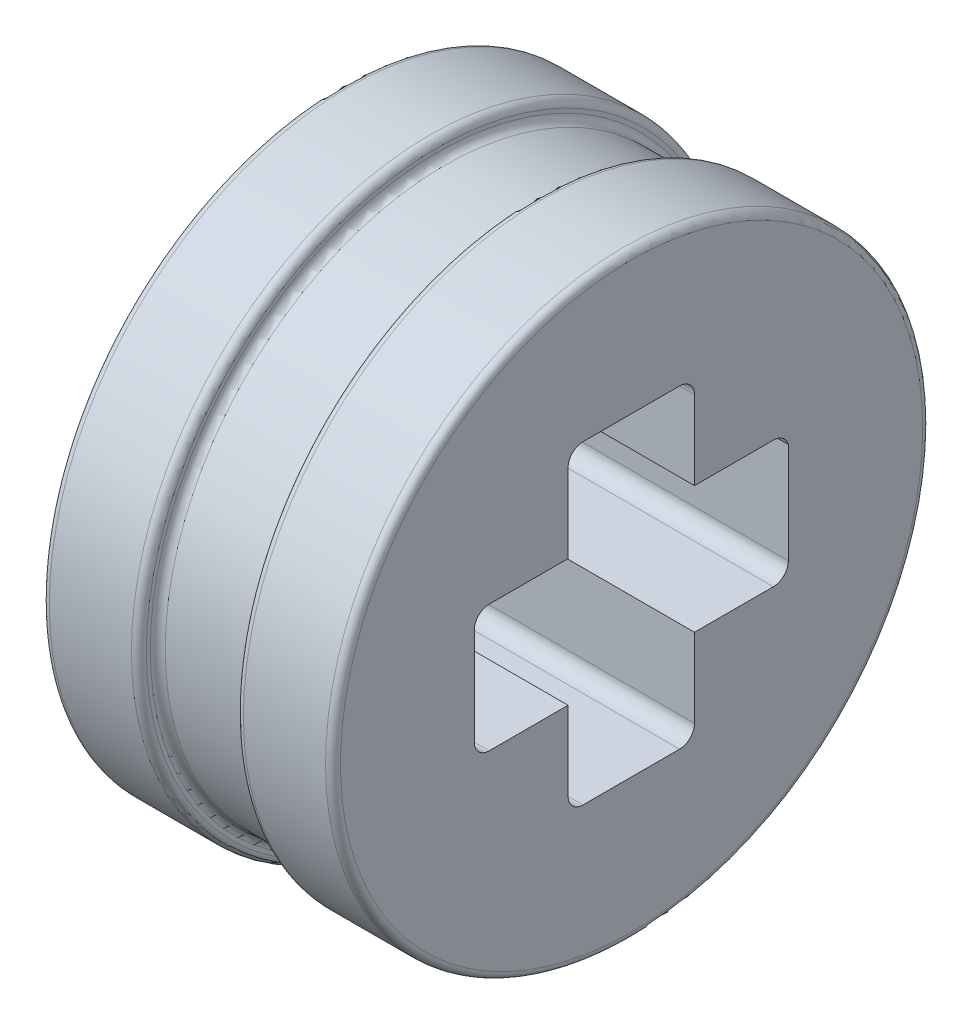
ISO-10303-21;
HEADER;
FILE_DESCRIPTION(('STEP AP214'),'2;1');
FILE_NAME('part.step','',(''),(''),'','','');
FILE_SCHEMA(('AUTOMOTIVE_DESIGN { 1 0 10303 214 1 1 1 1 }'));
ENDSEC;
DATA;
#1=APPLICATION_CONTEXT('core data for automotive mechanical design processes');
#2=APPLICATION_PROTOCOL_DEFINITION('international standard','automotive_design',2000,#1);
#3=PRODUCT_CONTEXT('',#1,'mechanical');
#4=PRODUCT('Part','Part','',(#3));
#5=PRODUCT_RELATED_PRODUCT_CATEGORY('part','',(#4));
#6=PRODUCT_DEFINITION_FORMATION('','',#4);
#7=PRODUCT_DEFINITION_CONTEXT('part definition',#1,'design');
#8=PRODUCT_DEFINITION('design','',#6,#7);
#9=PRODUCT_DEFINITION_SHAPE('','',#8);
#10=(LENGTH_UNIT() NAMED_UNIT(*) SI_UNIT(.MILLI.,.METRE.));
#11=(NAMED_UNIT(*) PLANE_ANGLE_UNIT() SI_UNIT($,.RADIAN.));
#12=(NAMED_UNIT(*) SI_UNIT($,.STERADIAN.) SOLID_ANGLE_UNIT());
#13=UNCERTAINTY_MEASURE_WITH_UNIT(LENGTH_MEASURE(1.E-05),#10,'distance_accuracy_value','');
#14=(GEOMETRIC_REPRESENTATION_CONTEXT(3) GLOBAL_UNCERTAINTY_ASSIGNED_CONTEXT((#13)) GLOBAL_UNIT_ASSIGNED_CONTEXT((#10,
#11,#12)) REPRESENTATION_CONTEXT('',''));
#15=CARTESIAN_POINT('',(0.,0.,0.));
#16=DIRECTION('',(0.,0.,1.));
#17=DIRECTION('',(1.,0.,0.));
#18=AXIS2_PLACEMENT_3D('',#15,#16,#17);
#19=CARTESIAN_POINT('',(6.45048689938073,0.,-4.));
#20=DIRECTION('',(-1.,0.,0.));
#21=DIRECTION('',(0.,0.,1.));
#22=AXIS2_PLACEMENT_3D('',#19,#20,#21);
#23=PLANE('',#22);
#24=CARTESIAN_POINT('',(6.45048689938073,0.,0.));
#25=DIRECTION('',(-1.,0.,0.));
#26=DIRECTION('',(0.,0.,1.));
#27=AXIS2_PLACEMENT_3D('',#24,#25,#26);
#28=CIRCLE('',#27,3.84702465337202);
#29=CARTESIAN_POINT('',(6.45048689938073,0.,3.84702465337202));
#30=VERTEX_POINT('',#29);
#31=EDGE_CURVE('E406',#30,#30,#28,.T.);
#32=ORIENTED_EDGE('',*,*,#31,.T.);
#33=EDGE_LOOP('',(#32));
#34=FACE_BOUND('',#33,.T.);
#35=CARTESIAN_POINT('',(6.45048689938073,0.,0.));
#36=DIRECTION('',(-1.,0.,0.));
#37=DIRECTION('',(0.,0.,1.));
#38=AXIS2_PLACEMENT_3D('',#35,#36,#37);
#39=CIRCLE('',#38,3.9);
#40=CARTESIAN_POINT('',(6.45048689938073,0.,3.9));
#41=VERTEX_POINT('',#40);
#42=EDGE_CURVE('E400',#41,#41,#39,.F.);
#43=ORIENTED_EDGE('',*,*,#42,.T.);
#44=EDGE_LOOP('',(#43));
#45=FACE_BOUND('',#44,.T.);
#46=ADVANCED_FACE('F45',(#34,#45),#23,.F.);
#47=CARTESIAN_POINT('',(7.75048689938073,0.,0.));
#48=DIRECTION('',(-1.,0.,0.));
#49=DIRECTION('',(0.,0.,1.));
#50=AXIS2_PLACEMENT_3D('',#47,#48,#49);
#51=CYLINDRICAL_SURFACE('',#50,4.);
#52=CARTESIAN_POINT('',(6.35048689938073,0.,0.));
#53=DIRECTION('',(-1.,0.,0.));
#54=DIRECTION('',(0.,0.,1.));
#55=AXIS2_PLACEMENT_3D('',#52,#53,#54);
#56=CIRCLE('',#55,4.);
#57=CARTESIAN_POINT('',(6.35048689938073,0.,4.));
#58=VERTEX_POINT('',#57);
#59=EDGE_CURVE('E397',#58,#58,#56,.T.);
#60=ORIENTED_EDGE('',*,*,#59,.T.);
#61=EDGE_LOOP('',(#60));
#62=FACE_BOUND('',#61,.T.);
#63=CARTESIAN_POINT('',(5.25,0.,0.));
#64=DIRECTION('',(1.,0.,0.));
#65=DIRECTION('',(0.,0.,-1.));
#66=AXIS2_PLACEMENT_3D('',#63,#64,#65);
#67=CIRCLE('',#66,4.);
#68=CARTESIAN_POINT('',(5.25,0.,-4.));
#69=VERTEX_POINT('',#68);
#70=EDGE_CURVE('E394',#69,#69,#67,.T.);
#71=ORIENTED_EDGE('',*,*,#70,.T.);
#72=EDGE_LOOP('',(#71));
#73=FACE_BOUND('',#72,.T.);
#74=ADVANCED_FACE('F425',(#62,#73),#51,.T.);
#75=CARTESIAN_POINT('',(7.75048689938073,0.,0.));
#76=DIRECTION('',(-1.,0.,0.));
#77=DIRECTION('',(0.,0.,1.));
#78=AXIS2_PLACEMENT_3D('',#75,#76,#77);
#79=CYLINDRICAL_SURFACE('',#78,3.74702465337202);
#80=CARTESIAN_POINT('',(6.55048689938073,0.,0.));
#81=DIRECTION('',(-1.,0.,0.));
#82=DIRECTION('',(0.,0.,1.));
#83=AXIS2_PLACEMENT_3D('',#80,#81,#82);
#84=CIRCLE('',#83,3.74702465337202);
#85=CARTESIAN_POINT('',(6.55048689938073,0.,3.74702465337202));
#86=VERTEX_POINT('',#85);
#87=EDGE_CURVE('E53',#86,#86,#84,.F.);
#88=ORIENTED_EDGE('',*,*,#87,.T.);
#89=EDGE_LOOP('',(#88));
#90=FACE_BOUND('',#89,.T.);
#91=CARTESIAN_POINT('',(7.65048689938073,0.,0.));
#92=DIRECTION('',(1.,0.,0.));
#93=DIRECTION('',(0.,0.,-1.));
#94=AXIS2_PLACEMENT_3D('',#91,#92,#93);
#95=CIRCLE('',#94,3.74702465337202);
#96=CARTESIAN_POINT('',(7.65048689938073,0.,-3.74702465337202));
#97=VERTEX_POINT('',#96);
#98=EDGE_CURVE('E409',#97,#97,#95,.F.);
#99=ORIENTED_EDGE('',*,*,#98,.T.);
#100=EDGE_LOOP('',(#99));
#101=FACE_BOUND('',#100,.T.);
#102=ADVANCED_FACE('F414',(#90,#101),#79,.T.);
#103=CARTESIAN_POINT('',(5.15,1.5,0.));
#104=DIRECTION('',(1.,0.,0.));
#105=DIRECTION('',(0.,0.,-1.));
#106=AXIS2_PLACEMENT_3D('',#103,#104,#105);
#107=PLANE('',#106);
#108=CARTESIAN_POINT('',(5.15,0.,0.));
#109=DIRECTION('',(1.,0.,0.));
#110=DIRECTION('',(0.,0.,-1.));
#111=AXIS2_PLACEMENT_3D('',#108,#109,#110);
#112=CIRCLE('',#111,3.9);
#113=CARTESIAN_POINT('',(5.15,0.,-3.9));
#114=VERTEX_POINT('',#113);
#115=EDGE_CURVE('E403',#114,#114,#112,.F.);
#116=ORIENTED_EDGE('',*,*,#115,.T.);
#117=EDGE_LOOP('',(#116));
#118=FACE_BOUND('',#117,.T.);
#119=DIRECTION('',(0.,-1.,0.));
#120=VECTOR('',#119,1.);
#121=CARTESIAN_POINT('',(5.15,0.858390623597305,-0.842935904204174));
#122=LINE('',#121,#120);
#123=CARTESIAN_POINT('',(5.15,1.91490213240289,-0.842935904204174));
#124=VERTEX_POINT('',#123);
#125=CARTESIAN_POINT('',(5.15,0.858390623597305,-0.842935904204174));
#126=VERTEX_POINT('',#125);
#127=EDGE_CURVE('E453',#124,#126,#122,.T.);
#128=ORIENTED_EDGE('',*,*,#127,.F.);
#129=CARTESIAN_POINT('',(5.15,1.91490213240289,-0.642935904204174));
#130=DIRECTION('',(-1.,0.,0.));
#131=DIRECTION('',(0.,0.,-1.));
#132=AXIS2_PLACEMENT_3D('',#129,#130,#131);
#133=CIRCLE('',#132,0.2);
#134=CARTESIAN_POINT('',(5.15,2.11490213240289,-0.642935904204174));
#135=VERTEX_POINT('',#134);
#136=EDGE_CURVE('E69',#135,#124,#133,.T.);
#137=ORIENTED_EDGE('',*,*,#136,.F.);
#138=DIRECTION('',(0.,0.,-1.));
#139=VECTOR('',#138,1.);
#140=CARTESIAN_POINT('',(5.15,2.11490213240289,-0.642935904204174));
#141=LINE('',#140,#139);
#142=CARTESIAN_POINT('',(5.15,2.11490213240289,0.650582266441982));
#143=VERTEX_POINT('',#142);
#144=EDGE_CURVE('E508',#143,#135,#141,.T.);
#145=ORIENTED_EDGE('',*,*,#144,.F.);
#146=CARTESIAN_POINT('',(5.15,1.91490213240289,0.650582266441982));
#147=DIRECTION('',(-1.,0.,0.));
#148=DIRECTION('',(0.,0.,1.));
#149=AXIS2_PLACEMENT_3D('',#146,#147,#148);
#150=CIRCLE('',#149,0.2);
#151=CARTESIAN_POINT('',(5.15,1.91490213240289,0.850582266441982));
#152=VERTEX_POINT('',#151);
#153=EDGE_CURVE('E505',#152,#143,#150,.T.);
#154=ORIENTED_EDGE('',*,*,#153,.F.);
#155=DIRECTION('',(0.,1.,0.));
#156=VECTOR('',#155,1.);
#157=CARTESIAN_POINT('',(5.15,1.91490213240289,0.850582266441982));
#158=LINE('',#157,#156);
#159=CARTESIAN_POINT('',(5.15,0.858390623597306,0.850582266441982));
#160=VERTEX_POINT('',#159);
#161=EDGE_CURVE('E503',#160,#152,#158,.T.);
#162=ORIENTED_EDGE('',*,*,#161,.F.);
#163=DIRECTION('',(0.,0.,-1.));
#164=VECTOR('',#163,1.);
#165=CARTESIAN_POINT('',(5.15,0.858390623597306,0.850582266441982));
#166=LINE('',#165,#164);
#167=CARTESIAN_POINT('',(5.15,0.858390623597306,1.90709377524756));
#168=VERTEX_POINT('',#167);
#169=EDGE_CURVE('E199',#168,#160,#166,.T.);
#170=ORIENTED_EDGE('',*,*,#169,.F.);
#171=CARTESIAN_POINT('',(5.15,0.658390623597305,1.90709377524756));
#172=DIRECTION('',(-1.,0.,0.));
#173=DIRECTION('',(0.,0.,-1.));
#174=AXIS2_PLACEMENT_3D('',#171,#172,#173);
#175=CIRCLE('',#174,0.2);
#176=CARTESIAN_POINT('',(5.15,0.658390623597305,2.10709377524756));
#177=VERTEX_POINT('',#176);
#178=EDGE_CURVE('E499',#177,#168,#175,.T.);
#179=ORIENTED_EDGE('',*,*,#178,.F.);
#180=DIRECTION('',(0.,1.,0.));
#181=VECTOR('',#180,1.);
#182=CARTESIAN_POINT('',(5.15,-0.642651568059718,2.10709377524756));
#183=LINE('',#182,#181);
#184=CARTESIAN_POINT('',(5.15,-0.642651568059718,2.10709377524756));
#185=VERTEX_POINT('',#184);
#186=EDGE_CURVE('E496',#185,#177,#183,.T.);
#187=ORIENTED_EDGE('',*,*,#186,.F.);
#188=CARTESIAN_POINT('',(5.15,-0.642651568059718,1.90709377524756));
#189=DIRECTION('',(-1.,0.,0.));
#190=DIRECTION('',(0.,0.,1.));
#191=AXIS2_PLACEMENT_3D('',#188,#189,#190);
#192=CIRCLE('',#191,0.200000000000001);
#193=CARTESIAN_POINT('',(5.15,-0.842651568059718,1.90709377524756));
#194=VERTEX_POINT('',#193);
#195=EDGE_CURVE('E493',#194,#185,#192,.T.);
#196=ORIENTED_EDGE('',*,*,#195,.F.);
#197=DIRECTION('',(0.,0.,1.));
#198=VECTOR('',#197,1.);
#199=CARTESIAN_POINT('',(5.15,-0.842651568059718,0.850582266441982));
#200=LINE('',#199,#198);
#201=CARTESIAN_POINT('',(5.15,-0.842651568059718,0.850582266441982));
#202=VERTEX_POINT('',#201);
#203=EDGE_CURVE('E490',#202,#194,#200,.T.);
#204=ORIENTED_EDGE('',*,*,#203,.F.);
#205=DIRECTION('',(0.,1.,0.));
#206=VECTOR('',#205,1.);
#207=CARTESIAN_POINT('',(5.15,-1.8991630768653,0.850582266441982));
#208=LINE('',#207,#206);
#209=CARTESIAN_POINT('',(5.15,-1.8991630768653,0.850582266441982));
#210=VERTEX_POINT('',#209);
#211=EDGE_CURVE('E487',#210,#202,#208,.T.);
#212=ORIENTED_EDGE('',*,*,#211,.F.);
#213=CARTESIAN_POINT('',(5.15,-1.8991630768653,0.650582266441982));
#214=DIRECTION('',(-1.,0.,0.));
#215=DIRECTION('',(0.,0.,-1.));
#216=AXIS2_PLACEMENT_3D('',#213,#214,#215);
#217=CIRCLE('',#216,0.2);
#218=CARTESIAN_POINT('',(5.15,-2.0991630768653,0.650582266441982));
#219=VERTEX_POINT('',#218);
#220=EDGE_CURVE('E484',#219,#210,#217,.T.);
#221=ORIENTED_EDGE('',*,*,#220,.F.);
#222=DIRECTION('',(0.,0.,1.));
#223=VECTOR('',#222,1.);
#224=CARTESIAN_POINT('',(5.15,-2.0991630768653,-0.642935904204174));
#225=LINE('',#224,#223);
#226=CARTESIAN_POINT('',(5.15,-2.0991630768653,-0.642935904204174));
#227=VERTEX_POINT('',#226);
#228=EDGE_CURVE('E481',#227,#219,#225,.T.);
#229=ORIENTED_EDGE('',*,*,#228,.F.);
#230=CARTESIAN_POINT('',(5.15,-1.8991630768653,-0.642935904204174));
#231=DIRECTION('',(-1.,0.,0.));
#232=DIRECTION('',(0.,0.,-1.));
#233=AXIS2_PLACEMENT_3D('',#230,#231,#232);
#234=CIRCLE('',#233,0.2);
#235=CARTESIAN_POINT('',(5.15,-1.8991630768653,-0.842935904204174));
#236=VERTEX_POINT('',#235);
#237=EDGE_CURVE('E478',#236,#227,#234,.T.);
#238=ORIENTED_EDGE('',*,*,#237,.F.);
#239=DIRECTION('',(0.,-1.,0.));
#240=VECTOR('',#239,1.);
#241=CARTESIAN_POINT('',(5.15,-0.842651568059718,-0.842935904204174));
#242=LINE('',#241,#240);
#243=CARTESIAN_POINT('',(5.15,-0.842651568059718,-0.842935904204174));
#244=VERTEX_POINT('',#243);
#245=EDGE_CURVE('E475',#244,#236,#242,.T.);
#246=ORIENTED_EDGE('',*,*,#245,.F.);
#247=DIRECTION('',(0.,0.,1.));
#248=VECTOR('',#247,1.);
#249=CARTESIAN_POINT('',(5.15,-0.842651568059718,-0.842935904204174));
#250=LINE('',#249,#248);
#251=CARTESIAN_POINT('',(5.15,-0.842651568059718,-1.89944741300976));
#252=VERTEX_POINT('',#251);
#253=EDGE_CURVE('E472',#252,#244,#250,.T.);
#254=ORIENTED_EDGE('',*,*,#253,.F.);
#255=CARTESIAN_POINT('',(5.15,-0.642651568059718,-1.89944741300976));
#256=DIRECTION('',(-1.,0.,0.));
#257=DIRECTION('',(0.,0.,-1.));
#258=AXIS2_PLACEMENT_3D('',#255,#256,#257);
#259=CIRCLE('',#258,0.2);
#260=CARTESIAN_POINT('',(5.15,-0.642651568059718,-2.09944741300976));
#261=VERTEX_POINT('',#260);
#262=EDGE_CURVE('E469',#261,#252,#259,.T.);
#263=ORIENTED_EDGE('',*,*,#262,.F.);
#264=DIRECTION('',(0.,-1.,0.));
#265=VECTOR('',#264,1.);
#266=CARTESIAN_POINT('',(5.15,-0.642651568059718,-2.09944741300976));
#267=LINE('',#266,#265);
#268=CARTESIAN_POINT('',(5.15,0.658390623597305,-2.09944741300976));
#269=VERTEX_POINT('',#268);
#270=EDGE_CURVE('E466',#269,#261,#267,.T.);
#271=ORIENTED_EDGE('',*,*,#270,.F.);
#272=CARTESIAN_POINT('',(5.15,0.658390623597305,-1.89944741300976));
#273=DIRECTION('',(-1.,0.,0.));
#274=DIRECTION('',(0.,0.,1.));
#275=AXIS2_PLACEMENT_3D('',#272,#273,#274);
#276=CIRCLE('',#275,0.2);
#277=CARTESIAN_POINT('',(5.15,0.858390623597305,-1.89944741300976));
#278=VERTEX_POINT('',#277);
#279=EDGE_CURVE('E460',#278,#269,#276,.T.);
#280=ORIENTED_EDGE('',*,*,#279,.F.);
#281=DIRECTION('',(0.,0.,-1.));
#282=VECTOR('',#281,1.);
#283=CARTESIAN_POINT('',(5.15,0.858390623597305,-1.89944741300976));
#284=LINE('',#283,#282);
#285=EDGE_CURVE('E457',#126,#278,#284,.T.);
#286=ORIENTED_EDGE('',*,*,#285,.F.);
#287=EDGE_LOOP('',(#128,#137,#145,#154,#162,#170,#179,#187,#196,#204,#212,#221,#229,#238,#246,
#254,#263,#271,#280,#286));
#288=FACE_BOUND('',#287,.T.);
#289=ADVANCED_FACE('F446',(#118,#288),#107,.F.);
#290=CARTESIAN_POINT('',(13.8,1.91490213240289,-0.642935904204174));
#291=DIRECTION('',(-1.,0.,0.));
#292=DIRECTION('',(0.,0.,1.));
#293=AXIS2_PLACEMENT_3D('',#290,#291,#292);
#294=CYLINDRICAL_SURFACE('',#293,0.2);
#295=DIRECTION('',(-1.,0.,0.));
#296=VECTOR('',#295,1.);
#297=CARTESIAN_POINT('',(13.8,2.11490213240289,-0.642935904204174));
#298=LINE('',#297,#296);
#299=CARTESIAN_POINT('',(9.05048689938073,2.11490213240289,-0.642935904204175));
#300=VERTEX_POINT('',#299);
#301=EDGE_CURVE('E512',#300,#135,#298,.T.);
#302=ORIENTED_EDGE('',*,*,#301,.T.);
#303=ORIENTED_EDGE('',*,*,#136,.T.);
#304=DIRECTION('',(-1.,0.,0.));
#305=VECTOR('',#304,1.);
#306=CARTESIAN_POINT('',(13.8,1.91490213240289,-0.842935904204174));
#307=LINE('',#306,#305);
#308=CARTESIAN_POINT('',(9.05048689938073,1.91490213240289,-0.842935904204175));
#309=VERTEX_POINT('',#308);
#310=EDGE_CURVE('E511',#309,#124,#307,.T.);
#311=ORIENTED_EDGE('',*,*,#310,.F.);
#312=CARTESIAN_POINT('',(9.05048689938073,1.91490213240289,-0.642935904204175));
#313=DIRECTION('',(1.,0.,0.));
#314=DIRECTION('',(0.,0.,-1.));
#315=AXIS2_PLACEMENT_3D('',#312,#313,#314);
#316=CIRCLE('',#315,0.2);
#317=EDGE_CURVE('E260',#309,#300,#316,.T.);
#318=ORIENTED_EDGE('',*,*,#317,.T.);
#319=EDGE_LOOP('',(#302,#303,#311,#318));
#320=FACE_BOUND('',#319,.T.);
#321=ADVANCED_FACE('F310',(#320),#294,.F.);
#322=CARTESIAN_POINT('',(13.8,2.11490213240289,-0.642935904204174));
#323=DIRECTION('',(0.,1.,0.));
#324=DIRECTION('',(0.,0.,1.));
#325=AXIS2_PLACEMENT_3D('',#322,#323,#324);
#326=PLANE('',#325);
#327=DIRECTION('',(-1.,0.,0.));
#328=VECTOR('',#327,1.);
#329=CARTESIAN_POINT('',(13.8,2.11490213240289,0.650582266441982));
#330=LINE('',#329,#328);
#331=CARTESIAN_POINT('',(9.05048689938073,2.11490213240289,0.650582266441982));
#332=VERTEX_POINT('',#331);
#333=EDGE_CURVE('E514',#332,#143,#330,.T.);
#334=ORIENTED_EDGE('',*,*,#333,.T.);
#335=ORIENTED_EDGE('',*,*,#144,.T.);
#336=ORIENTED_EDGE('',*,*,#301,.F.);
#337=DIRECTION('',(0.,0.,1.));
#338=VECTOR('',#337,1.);
#339=CARTESIAN_POINT('',(9.05048689938073,2.11490213240289,0.650582266441982));
#340=LINE('',#339,#338);
#341=EDGE_CURVE('E263',#300,#332,#340,.T.);
#342=ORIENTED_EDGE('',*,*,#341,.T.);
#343=EDGE_LOOP('',(#334,#335,#336,#342));
#344=FACE_BOUND('',#343,.T.);
#345=ADVANCED_FACE('F306',(#344),#326,.F.);
#346=CARTESIAN_POINT('',(13.8,1.91490213240289,0.650582266441982));
#347=DIRECTION('',(-1.,0.,0.));
#348=DIRECTION('',(0.,0.,1.));
#349=AXIS2_PLACEMENT_3D('',#346,#347,#348);
#350=CYLINDRICAL_SURFACE('',#349,0.2);
#351=DIRECTION('',(-1.,0.,0.));
#352=VECTOR('',#351,1.);
#353=CARTESIAN_POINT('',(13.8,1.91490213240289,0.850582266441982));
#354=LINE('',#353,#352);
#355=CARTESIAN_POINT('',(9.05048689938073,1.91490213240289,0.850582266441982));
#356=VERTEX_POINT('',#355);
#357=EDGE_CURVE('E203',#356,#152,#354,.T.);
#358=ORIENTED_EDGE('',*,*,#357,.T.);
#359=ORIENTED_EDGE('',*,*,#153,.T.);
#360=ORIENTED_EDGE('',*,*,#333,.F.);
#361=CARTESIAN_POINT('',(9.05048689938073,1.91490213240289,0.650582266441982));
#362=DIRECTION('',(1.,0.,0.));
#363=DIRECTION('',(0.,0.,1.));
#364=AXIS2_PLACEMENT_3D('',#361,#362,#363);
#365=CIRCLE('',#364,0.2);
#366=EDGE_CURVE('E266',#332,#356,#365,.T.);
#367=ORIENTED_EDGE('',*,*,#366,.T.);
#368=EDGE_LOOP('',(#358,#359,#360,#367));
#369=FACE_BOUND('',#368,.T.);
#370=ADVANCED_FACE('F309',(#369),#350,.F.);
#371=CARTESIAN_POINT('',(13.8,1.91490213240289,0.850582266441982));
#372=DIRECTION('',(0.,0.,1.));
#373=DIRECTION('',(0.,-1.,0.));
#374=AXIS2_PLACEMENT_3D('',#371,#372,#373);
#375=PLANE('',#374);
#376=DIRECTION('',(-1.,0.,0.));
#377=VECTOR('',#376,1.);
#378=CARTESIAN_POINT('',(13.8,0.858390623597306,0.850582266441982));
#379=LINE('',#378,#377);
#380=CARTESIAN_POINT('',(9.05048689938073,0.858390623597306,0.850582266441982));
#381=VERTEX_POINT('',#380);
#382=EDGE_CURVE('E192',#381,#160,#379,.T.);
#383=ORIENTED_EDGE('',*,*,#382,.T.);
#384=ORIENTED_EDGE('',*,*,#161,.T.);
#385=ORIENTED_EDGE('',*,*,#357,.F.);
#386=DIRECTION('',(0.,-1.,0.));
#387=VECTOR('',#386,1.);
#388=CARTESIAN_POINT('',(9.05048689938073,0.858390623597306,0.850582266441982));
#389=LINE('',#388,#387);
#390=EDGE_CURVE('E207',#356,#381,#389,.T.);
#391=ORIENTED_EDGE('',*,*,#390,.T.);
#392=EDGE_LOOP('',(#383,#384,#385,#391));
#393=FACE_BOUND('',#392,.T.);
#394=ADVANCED_FACE('F208',(#393),#375,.F.);
#395=CARTESIAN_POINT('',(13.8,0.858390623597306,0.850582266441982));
#396=DIRECTION('',(0.,1.,0.));
#397=DIRECTION('',(0.,0.,1.));
#398=AXIS2_PLACEMENT_3D('',#395,#396,#397);
#399=PLANE('',#398);
#400=DIRECTION('',(-1.,0.,0.));
#401=VECTOR('',#400,1.);
#402=CARTESIAN_POINT('',(13.8,0.858390623597306,1.90709377524756));
#403=LINE('',#402,#401);
#404=CARTESIAN_POINT('',(9.05048689938073,0.858390623597306,1.90709377524756));
#405=VERTEX_POINT('',#404);
#406=EDGE_CURVE('E204',#405,#168,#403,.T.);
#407=ORIENTED_EDGE('',*,*,#406,.T.);
#408=ORIENTED_EDGE('',*,*,#169,.T.);
#409=ORIENTED_EDGE('',*,*,#382,.F.);
#410=DIRECTION('',(0.,0.,1.));
#411=VECTOR('',#410,1.);
#412=CARTESIAN_POINT('',(9.05048689938073,0.858390623597306,0.850582266441982));
#413=LINE('',#412,#411);
#414=EDGE_CURVE('E196',#381,#405,#413,.T.);
#415=ORIENTED_EDGE('',*,*,#414,.T.);
#416=EDGE_LOOP('',(#407,#408,#409,#415));
#417=FACE_BOUND('',#416,.T.);
#418=ADVANCED_FACE('F194',(#417),#399,.F.);
#419=CARTESIAN_POINT('',(13.8,0.658390623597305,1.90709377524756));
#420=DIRECTION('',(-1.,0.,0.));
#421=DIRECTION('',(0.,0.,1.));
#422=AXIS2_PLACEMENT_3D('',#419,#420,#421);
#423=CYLINDRICAL_SURFACE('',#422,0.2);
#424=DIRECTION('',(-1.,0.,0.));
#425=VECTOR('',#424,1.);
#426=CARTESIAN_POINT('',(13.8,0.658390623597305,2.10709377524756));
#427=LINE('',#426,#425);
#428=CARTESIAN_POINT('',(9.05048689938073,0.658390623597305,2.10709377524756));
#429=VERTEX_POINT('',#428);
#430=EDGE_CURVE('E518',#429,#177,#427,.T.);
#431=ORIENTED_EDGE('',*,*,#430,.T.);
#432=ORIENTED_EDGE('',*,*,#178,.T.);
#433=ORIENTED_EDGE('',*,*,#406,.F.);
#434=CARTESIAN_POINT('',(9.05048689938073,0.658390623597305,1.90709377524756));
#435=DIRECTION('',(1.,0.,0.));
#436=DIRECTION('',(0.,0.,1.));
#437=AXIS2_PLACEMENT_3D('',#434,#435,#436);
#438=CIRCLE('',#437,0.2);
#439=EDGE_CURVE('E216',#405,#429,#438,.T.);
#440=ORIENTED_EDGE('',*,*,#439,.T.);
#441=EDGE_LOOP('',(#431,#432,#433,#440));
#442=FACE_BOUND('',#441,.T.);
#443=ADVANCED_FACE('F319',(#442),#423,.F.);
#444=CARTESIAN_POINT('',(13.8,-0.642651568059718,2.10709377524756));
#445=DIRECTION('',(0.,0.,1.));
#446=DIRECTION('',(1.,0.,0.));
#447=AXIS2_PLACEMENT_3D('',#444,#445,#446);
#448=PLANE('',#447);
#449=DIRECTION('',(-1.,0.,0.));
#450=VECTOR('',#449,1.);
#451=CARTESIAN_POINT('',(13.8,-0.642651568059718,2.10709377524756));
#452=LINE('',#451,#450);
#453=CARTESIAN_POINT('',(9.05048689938073,-0.642651568059718,2.10709377524756));
#454=VERTEX_POINT('',#453);
#455=EDGE_CURVE('E520',#454,#185,#452,.T.);
#456=ORIENTED_EDGE('',*,*,#455,.T.);
#457=ORIENTED_EDGE('',*,*,#186,.T.);
#458=ORIENTED_EDGE('',*,*,#430,.F.);
#459=DIRECTION('',(0.,-1.,0.));
#460=VECTOR('',#459,1.);
#461=CARTESIAN_POINT('',(9.05048689938073,0.658390623597305,2.10709377524756));
#462=LINE('',#461,#460);
#463=EDGE_CURVE('E218',#429,#454,#462,.T.);
#464=ORIENTED_EDGE('',*,*,#463,.T.);
#465=EDGE_LOOP('',(#456,#457,#458,#464));
#466=FACE_BOUND('',#465,.T.);
#467=ADVANCED_FACE('F322',(#466),#448,.F.);
#468=CARTESIAN_POINT('',(13.8,-0.642651568059718,1.90709377524756));
#469=DIRECTION('',(-1.,0.,0.));
#470=DIRECTION('',(0.,0.,1.));
#471=AXIS2_PLACEMENT_3D('',#468,#469,#470);
#472=CYLINDRICAL_SURFACE('',#471,0.200000000000001);
#473=DIRECTION('',(-1.,0.,0.));
#474=VECTOR('',#473,1.);
#475=CARTESIAN_POINT('',(13.8,-0.842651568059718,1.90709377524756));
#476=LINE('',#475,#474);
#477=CARTESIAN_POINT('',(9.05048689938073,-0.842651568059718,1.90709377524756));
#478=VERTEX_POINT('',#477);
#479=EDGE_CURVE('E522',#478,#194,#476,.T.);
#480=ORIENTED_EDGE('',*,*,#479,.T.);
#481=ORIENTED_EDGE('',*,*,#195,.T.);
#482=ORIENTED_EDGE('',*,*,#455,.F.);
#483=CARTESIAN_POINT('',(9.05048689938073,-0.642651568059718,1.90709377524756));
#484=DIRECTION('',(1.,0.,0.));
#485=DIRECTION('',(0.,0.,1.));
#486=AXIS2_PLACEMENT_3D('',#483,#484,#485);
#487=CIRCLE('',#486,0.200000000000001);
#488=EDGE_CURVE('E223',#454,#478,#487,.T.);
#489=ORIENTED_EDGE('',*,*,#488,.T.);
#490=EDGE_LOOP('',(#480,#481,#482,#489));
#491=FACE_BOUND('',#490,.T.);
#492=ADVANCED_FACE('F326',(#491),#472,.F.);
#493=CARTESIAN_POINT('',(13.8,-0.842651568059718,0.850582266441982));
#494=DIRECTION('',(0.,-1.,0.));
#495=DIRECTION('',(0.,0.,-1.));
#496=AXIS2_PLACEMENT_3D('',#493,#494,#495);
#497=PLANE('',#496);
#498=DIRECTION('',(-1.,0.,0.));
#499=VECTOR('',#498,1.);
#500=CARTESIAN_POINT('',(13.8,-0.842651568059718,0.850582266441982));
#501=LINE('',#500,#499);
#502=CARTESIAN_POINT('',(9.05048689938073,-0.842651568059718,0.850582266441982));
#503=VERTEX_POINT('',#502);
#504=EDGE_CURVE('E524',#503,#202,#501,.T.);
#505=ORIENTED_EDGE('',*,*,#504,.T.);
#506=ORIENTED_EDGE('',*,*,#203,.T.);
#507=ORIENTED_EDGE('',*,*,#479,.F.);
#508=DIRECTION('',(0.,0.,-1.));
#509=VECTOR('',#508,1.);
#510=CARTESIAN_POINT('',(9.05048689938073,-0.842651568059718,1.90709377524756));
#511=LINE('',#510,#509);
#512=EDGE_CURVE('E226',#478,#503,#511,.T.);
#513=ORIENTED_EDGE('',*,*,#512,.T.);
#514=EDGE_LOOP('',(#505,#506,#507,#513));
#515=FACE_BOUND('',#514,.T.);
#516=ADVANCED_FACE('F330',(#515),#497,.F.);
#517=CARTESIAN_POINT('',(13.8,-1.8991630768653,0.850582266441982));
#518=DIRECTION('',(0.,0.,1.));
#519=DIRECTION('',(1.,0.,0.));
#520=AXIS2_PLACEMENT_3D('',#517,#518,#519);
#521=PLANE('',#520);
#522=DIRECTION('',(-1.,0.,0.));
#523=VECTOR('',#522,1.);
#524=CARTESIAN_POINT('',(13.8,-1.8991630768653,0.850582266441982));
#525=LINE('',#524,#523);
#526=CARTESIAN_POINT('',(9.05048689938073,-1.8991630768653,0.850582266441982));
#527=VERTEX_POINT('',#526);
#528=EDGE_CURVE('E526',#527,#210,#525,.T.);
#529=ORIENTED_EDGE('',*,*,#528,.T.);
#530=ORIENTED_EDGE('',*,*,#211,.T.);
#531=ORIENTED_EDGE('',*,*,#504,.F.);
#532=DIRECTION('',(0.,-1.,0.));
#533=VECTOR('',#532,1.);
#534=CARTESIAN_POINT('',(9.05048689938073,-0.842651568059718,0.850582266441982));
#535=LINE('',#534,#533);
#536=EDGE_CURVE('E229',#503,#527,#535,.T.);
#537=ORIENTED_EDGE('',*,*,#536,.T.);
#538=EDGE_LOOP('',(#529,#530,#531,#537));
#539=FACE_BOUND('',#538,.T.);
#540=ADVANCED_FACE('F334',(#539),#521,.F.);
#541=CARTESIAN_POINT('',(13.8,-1.8991630768653,0.650582266441982));
#542=DIRECTION('',(-1.,0.,0.));
#543=DIRECTION('',(0.,0.,1.));
#544=AXIS2_PLACEMENT_3D('',#541,#542,#543);
#545=CYLINDRICAL_SURFACE('',#544,0.2);
#546=DIRECTION('',(-1.,0.,0.));
#547=VECTOR('',#546,1.);
#548=CARTESIAN_POINT('',(13.8,-2.0991630768653,0.650582266441982));
#549=LINE('',#548,#547);
#550=CARTESIAN_POINT('',(9.05048689938073,-2.0991630768653,0.650582266441981));
#551=VERTEX_POINT('',#550);
#552=EDGE_CURVE('E528',#551,#219,#549,.T.);
#553=ORIENTED_EDGE('',*,*,#552,.T.);
#554=ORIENTED_EDGE('',*,*,#220,.T.);
#555=ORIENTED_EDGE('',*,*,#528,.F.);
#556=CARTESIAN_POINT('',(9.05048689938073,-1.8991630768653,0.650582266441982));
#557=DIRECTION('',(1.,0.,0.));
#558=DIRECTION('',(0.,0.,-1.));
#559=AXIS2_PLACEMENT_3D('',#556,#557,#558);
#560=CIRCLE('',#559,0.2);
#561=EDGE_CURVE('E232',#527,#551,#560,.T.);
#562=ORIENTED_EDGE('',*,*,#561,.T.);
#563=EDGE_LOOP('',(#553,#554,#555,#562));
#564=FACE_BOUND('',#563,.T.);
#565=ADVANCED_FACE('F338',(#564),#545,.F.);
#566=CARTESIAN_POINT('',(13.8,-2.0991630768653,-0.642935904204174));
#567=DIRECTION('',(0.,-1.,0.));
#568=DIRECTION('',(0.,0.,-1.));
#569=AXIS2_PLACEMENT_3D('',#566,#567,#568);
#570=PLANE('',#569);
#571=DIRECTION('',(-1.,0.,0.));
#572=VECTOR('',#571,1.);
#573=CARTESIAN_POINT('',(13.8,-2.0991630768653,-0.642935904204174));
#574=LINE('',#573,#572);
#575=CARTESIAN_POINT('',(9.05048689938073,-2.0991630768653,-0.642935904204175));
#576=VERTEX_POINT('',#575);
#577=EDGE_CURVE('E530',#576,#227,#574,.T.);
#578=ORIENTED_EDGE('',*,*,#577,.T.);
#579=ORIENTED_EDGE('',*,*,#228,.T.);
#580=ORIENTED_EDGE('',*,*,#552,.F.);
#581=DIRECTION('',(0.,0.,-1.));
#582=VECTOR('',#581,1.);
#583=CARTESIAN_POINT('',(9.05048689938073,-2.0991630768653,0.650582266441981));
#584=LINE('',#583,#582);
#585=EDGE_CURVE('E235',#551,#576,#584,.T.);
#586=ORIENTED_EDGE('',*,*,#585,.T.);
#587=EDGE_LOOP('',(#578,#579,#580,#586));
#588=FACE_BOUND('',#587,.T.);
#589=ADVANCED_FACE('F342',(#588),#570,.F.);
#590=CARTESIAN_POINT('',(13.8,-1.8991630768653,-0.642935904204174));
#591=DIRECTION('',(-1.,0.,0.));
#592=DIRECTION('',(0.,0.,1.));
#593=AXIS2_PLACEMENT_3D('',#590,#591,#592);
#594=CYLINDRICAL_SURFACE('',#593,0.2);
#595=DIRECTION('',(-1.,0.,0.));
#596=VECTOR('',#595,1.);
#597=CARTESIAN_POINT('',(13.8,-1.8991630768653,-0.842935904204174));
#598=LINE('',#597,#596);
#599=CARTESIAN_POINT('',(9.05048689938073,-1.8991630768653,-0.842935904204175));
#600=VERTEX_POINT('',#599);
#601=EDGE_CURVE('E532',#600,#236,#598,.T.);
#602=ORIENTED_EDGE('',*,*,#601,.T.);
#603=ORIENTED_EDGE('',*,*,#237,.T.);
#604=ORIENTED_EDGE('',*,*,#577,.F.);
#605=CARTESIAN_POINT('',(9.05048689938073,-1.8991630768653,-0.642935904204175));
#606=DIRECTION('',(1.,0.,0.));
#607=DIRECTION('',(0.,0.,1.));
#608=AXIS2_PLACEMENT_3D('',#605,#606,#607);
#609=CIRCLE('',#608,0.2);
#610=EDGE_CURVE('E238',#576,#600,#609,.T.);
#611=ORIENTED_EDGE('',*,*,#610,.T.);
#612=EDGE_LOOP('',(#602,#603,#604,#611));
#613=FACE_BOUND('',#612,.T.);
#614=ADVANCED_FACE('F346',(#613),#594,.F.);
#615=CARTESIAN_POINT('',(13.8,-0.842651568059718,-0.842935904204174));
#616=DIRECTION('',(0.,0.,-1.));
#617=DIRECTION('',(-1.,0.,0.));
#618=AXIS2_PLACEMENT_3D('',#615,#616,#617);
#619=PLANE('',#618);
#620=DIRECTION('',(-1.,0.,0.));
#621=VECTOR('',#620,1.);
#622=CARTESIAN_POINT('',(13.8,-0.842651568059718,-0.842935904204174));
#623=LINE('',#622,#621);
#624=CARTESIAN_POINT('',(9.05048689938073,-0.842651568059718,-0.842935904204175));
#625=VERTEX_POINT('',#624);
#626=EDGE_CURVE('E534',#625,#244,#623,.T.);
#627=ORIENTED_EDGE('',*,*,#626,.T.);
#628=ORIENTED_EDGE('',*,*,#245,.T.);
#629=ORIENTED_EDGE('',*,*,#601,.F.);
#630=DIRECTION('',(0.,1.,0.));
#631=VECTOR('',#630,1.);
#632=CARTESIAN_POINT('',(9.05048689938073,-1.8991630768653,-0.842935904204175));
#633=LINE('',#632,#631);
#634=EDGE_CURVE('E241',#600,#625,#633,.T.);
#635=ORIENTED_EDGE('',*,*,#634,.T.);
#636=EDGE_LOOP('',(#627,#628,#629,#635));
#637=FACE_BOUND('',#636,.T.);
#638=ADVANCED_FACE('F350',(#637),#619,.F.);
#639=CARTESIAN_POINT('',(13.8,-0.842651568059718,-0.842935904204174));
#640=DIRECTION('',(0.,-1.,0.));
#641=DIRECTION('',(0.,0.,-1.));
#642=AXIS2_PLACEMENT_3D('',#639,#640,#641);
#643=PLANE('',#642);
#644=DIRECTION('',(-1.,0.,0.));
#645=VECTOR('',#644,1.);
#646=CARTESIAN_POINT('',(13.8,-0.842651568059718,-1.89944741300976));
#647=LINE('',#646,#645);
#648=CARTESIAN_POINT('',(9.05048689938073,-0.842651568059718,-1.89944741300976));
#649=VERTEX_POINT('',#648);
#650=EDGE_CURVE('E536',#649,#252,#647,.T.);
#651=ORIENTED_EDGE('',*,*,#650,.T.);
#652=ORIENTED_EDGE('',*,*,#253,.T.);
#653=ORIENTED_EDGE('',*,*,#626,.F.);
#654=DIRECTION('',(0.,0.,-1.));
#655=VECTOR('',#654,1.);
#656=CARTESIAN_POINT('',(9.05048689938073,-0.842651568059718,-0.842935904204175));
#657=LINE('',#656,#655);
#658=EDGE_CURVE('E244',#625,#649,#657,.T.);
#659=ORIENTED_EDGE('',*,*,#658,.T.);
#660=EDGE_LOOP('',(#651,#652,#653,#659));
#661=FACE_BOUND('',#660,.T.);
#662=ADVANCED_FACE('F354',(#661),#643,.F.);
#663=CARTESIAN_POINT('',(13.8,-0.642651568059718,-1.89944741300976));
#664=DIRECTION('',(-1.,0.,0.));
#665=DIRECTION('',(0.,0.,1.));
#666=AXIS2_PLACEMENT_3D('',#663,#664,#665);
#667=CYLINDRICAL_SURFACE('',#666,0.2);
#668=DIRECTION('',(-1.,0.,0.));
#669=VECTOR('',#668,1.);
#670=CARTESIAN_POINT('',(13.8,-0.642651568059718,-2.09944741300976));
#671=LINE('',#670,#669);
#672=CARTESIAN_POINT('',(9.05048689938073,-0.642651568059718,-2.09944741300976));
#673=VERTEX_POINT('',#672);
#674=EDGE_CURVE('E538',#673,#261,#671,.T.);
#675=ORIENTED_EDGE('',*,*,#674,.T.);
#676=ORIENTED_EDGE('',*,*,#262,.T.);
#677=ORIENTED_EDGE('',*,*,#650,.F.);
#678=CARTESIAN_POINT('',(9.05048689938073,-0.642651568059718,-1.89944741300976));
#679=DIRECTION('',(1.,0.,0.));
#680=DIRECTION('',(0.,0.,1.));
#681=AXIS2_PLACEMENT_3D('',#678,#679,#680);
#682=CIRCLE('',#681,0.2);
#683=EDGE_CURVE('E247',#649,#673,#682,.T.);
#684=ORIENTED_EDGE('',*,*,#683,.T.);
#685=EDGE_LOOP('',(#675,#676,#677,#684));
#686=FACE_BOUND('',#685,.T.);
#687=ADVANCED_FACE('F358',(#686),#667,.F.);
#688=CARTESIAN_POINT('',(13.8,-0.642651568059718,-2.09944741300976));
#689=DIRECTION('',(0.,0.,-1.));
#690=DIRECTION('',(-1.,0.,0.));
#691=AXIS2_PLACEMENT_3D('',#688,#689,#690);
#692=PLANE('',#691);
#693=DIRECTION('',(-1.,0.,0.));
#694=VECTOR('',#693,1.);
#695=CARTESIAN_POINT('',(13.8,0.658390623597305,-2.09944741300976));
#696=LINE('',#695,#694);
#697=CARTESIAN_POINT('',(7.75048689938073,0.658390623597305,-2.09944741300976));
#698=VERTEX_POINT('',#697);
#699=EDGE_CURVE('E559',#698,#269,#696,.T.);
#700=ORIENTED_EDGE('',*,*,#699,.T.);
#701=ORIENTED_EDGE('',*,*,#270,.T.);
#702=ORIENTED_EDGE('',*,*,#674,.F.);
#703=DIRECTION('',(0.,1.,0.));
#704=VECTOR('',#703,1.);
#705=CARTESIAN_POINT('',(9.05048689938073,-0.642651568059718,-2.09944741300976));
#706=LINE('',#705,#704);
#707=CARTESIAN_POINT('',(9.05048689938073,0.707493826913333,-2.09944741300976));
#708=VERTEX_POINT('',#707);
#709=EDGE_CURVE('E250',#673,#708,#706,.T.);
#710=ORIENTED_EDGE('',*,*,#709,.T.);
#711=DIRECTION('',(-1.,0.,0.));
#712=VECTOR('',#711,1.);
#713=CARTESIAN_POINT('',(9.05048689938073,0.707493826913333,-2.09944741300976));
#714=LINE('',#713,#712);
#715=CARTESIAN_POINT('',(7.75048689938073,0.706816636069282,-2.09655566274477));
#716=VERTEX_POINT('',#715);
#717=EDGE_CURVE('E269',#708,#716,#714,.T.);
#718=ORIENTED_EDGE('',*,*,#717,.T.);
#719=CARTESIAN_POINT('',(7.75048689938073,0.707493826913333,-2.09944741300976));
#720=DIRECTION('',(0.,-1.,0.));
#721=VECTOR('',#720,1.);
#722=LINE('',#719,#721);
#723=EDGE_CURVE('E60',#716,#698,#722,.T.);
#724=ORIENTED_EDGE('',*,*,#723,.T.);
#725=EDGE_LOOP('',(#700,#701,#702,#710,#718,#724));
#726=FACE_BOUND('',#725,.T.);
#727=ADVANCED_FACE('F362',(#726),#692,.F.);
#728=CARTESIAN_POINT('',(13.8,0.658390623597305,-1.89944741300976));
#729=DIRECTION('',(-1.,0.,0.));
#730=DIRECTION('',(0.,0.,1.));
#731=AXIS2_PLACEMENT_3D('',#728,#729,#730);
#732=CYLINDRICAL_SURFACE('',#731,0.2);
#733=DIRECTION('',(-1.,0.,0.));
#734=VECTOR('',#733,1.);
#735=CARTESIAN_POINT('',(13.8,0.858390623597305,-1.89944741300976));
#736=LINE('',#735,#734);
#737=CARTESIAN_POINT('',(7.75048689938073,0.858390623597305,-1.89944741300976));
#738=VERTEX_POINT('',#737);
#739=EDGE_CURVE('E541',#738,#278,#736,.T.);
#740=ORIENTED_EDGE('',*,*,#739,.T.);
#741=ORIENTED_EDGE('',*,*,#279,.T.);
#742=ORIENTED_EDGE('',*,*,#699,.F.);
#743=ORIENTED_EDGE('',*,*,#723,.F.);
#744=CARTESIAN_POINT('',(7.75048689938073,0.650401306962093,-1.89944741300976));
#745=DIRECTION('',(-1.,0.,0.));
#746=DIRECTION('',(0.,1.,0.));
#747=AXIS2_PLACEMENT_3D('',#744,#745,#746);
#748=CIRCLE('',#747,0.207989316635213);
#749=EDGE_CURVE('E278',#738,#716,#748,.T.);
#750=ORIENTED_EDGE('',*,*,#749,.F.);
#751=EDGE_LOOP('',(#740,#741,#742,#743,#750));
#752=FACE_BOUND('',#751,.T.);
#753=ADVANCED_FACE('F367',(#752),#732,.F.);
#754=CARTESIAN_POINT('',(13.8,0.858390623597305,-1.89944741300976));
#755=DIRECTION('',(0.,1.,0.));
#756=DIRECTION('',(0.,0.,1.));
#757=AXIS2_PLACEMENT_3D('',#754,#755,#756);
#758=PLANE('',#757);
#759=DIRECTION('',(-1.,0.,0.));
#760=VECTOR('',#759,1.);
#761=CARTESIAN_POINT('',(13.8,0.858390623597305,-0.842935904204174));
#762=LINE('',#761,#760);
#763=CARTESIAN_POINT('',(9.05048689938073,0.858390623597305,-0.842935904204175));
#764=VERTEX_POINT('',#763);
#765=EDGE_CURVE('E539',#764,#126,#762,.T.);
#766=ORIENTED_EDGE('',*,*,#765,.T.);
#767=ORIENTED_EDGE('',*,*,#285,.T.);
#768=ORIENTED_EDGE('',*,*,#739,.F.);
#769=DIRECTION('',(-1.,0.,0.));
#770=VECTOR('',#769,1.);
#771=CARTESIAN_POINT('',(9.05048689938073,0.858390623597305,-1.89944741300976));
#772=LINE('',#771,#770);
#773=CARTESIAN_POINT('',(9.05048689938073,0.858390623597305,-1.89944741300976));
#774=VERTEX_POINT('',#773);
#775=EDGE_CURVE('E268',#774,#738,#772,.T.);
#776=ORIENTED_EDGE('',*,*,#775,.F.);
#777=DIRECTION('',(0.,0.,1.));
#778=VECTOR('',#777,1.);
#779=CARTESIAN_POINT('',(9.05048689938073,0.858390623597305,-0.842935904204175));
#780=LINE('',#779,#778);
#781=EDGE_CURVE('E254',#774,#764,#780,.T.);
#782=ORIENTED_EDGE('',*,*,#781,.T.);
#783=EDGE_LOOP('',(#766,#767,#768,#776,#782));
#784=FACE_BOUND('',#783,.T.);
#785=ADVANCED_FACE('F565',(#784),#758,.F.);
#786=CARTESIAN_POINT('',(13.8,0.858390623597305,-0.842935904204174));
#787=DIRECTION('',(0.,0.,-1.));
#788=DIRECTION('',(-1.,0.,0.));
#789=AXIS2_PLACEMENT_3D('',#786,#787,#788);
#790=PLANE('',#789);
#791=ORIENTED_EDGE('',*,*,#310,.T.);
#792=ORIENTED_EDGE('',*,*,#127,.T.);
#793=ORIENTED_EDGE('',*,*,#765,.F.);
#794=DIRECTION('',(0.,1.,0.));
#795=VECTOR('',#794,1.);
#796=CARTESIAN_POINT('',(9.05048689938073,0.858390623597305,-0.842935904204175));
#797=LINE('',#796,#795);
#798=EDGE_CURVE('E257',#764,#309,#797,.T.);
#799=ORIENTED_EDGE('',*,*,#798,.T.);
#800=EDGE_LOOP('',(#791,#792,#793,#799));
#801=FACE_BOUND('',#800,.T.);
#802=ADVANCED_FACE('F298',(#801),#790,.F.);
#803=CARTESIAN_POINT('',(9.05048689938073,0.,0.));
#804=DIRECTION('',(1.,0.,0.));
#805=DIRECTION('',(0.,0.,-1.));
#806=AXIS2_PLACEMENT_3D('',#803,#804,#805);
#807=PLANE('',#806);
#808=CARTESIAN_POINT('',(9.05048689938073,0.,0.));
#809=DIRECTION('',(1.,0.,0.));
#810=DIRECTION('',(0.,0.,-1.));
#811=AXIS2_PLACEMENT_3D('',#808,#809,#810);
#812=CIRCLE('',#811,3.9);
#813=CARTESIAN_POINT('',(9.05048689938073,0.,-3.9));
#814=VERTEX_POINT('',#813);
#815=EDGE_CURVE('E391',#814,#814,#812,.T.);
#816=ORIENTED_EDGE('',*,*,#815,.T.);
#817=EDGE_LOOP('',(#816));
#818=FACE_BOUND('',#817,.T.);
#819=ORIENTED_EDGE('',*,*,#414,.F.);
#820=ORIENTED_EDGE('',*,*,#390,.F.);
#821=ORIENTED_EDGE('',*,*,#366,.F.);
#822=ORIENTED_EDGE('',*,*,#341,.F.);
#823=ORIENTED_EDGE('',*,*,#317,.F.);
#824=ORIENTED_EDGE('',*,*,#798,.F.);
#825=ORIENTED_EDGE('',*,*,#781,.F.);
#826=CARTESIAN_POINT('',(9.05048689938073,0.650401306962093,-1.89944741300976));
#827=DIRECTION('',(1.,0.,0.));
#828=DIRECTION('',(0.,0.,1.));
#829=AXIS2_PLACEMENT_3D('',#826,#827,#828);
#830=CIRCLE('',#829,0.207989316635213);
#831=EDGE_CURVE('E252',#708,#774,#830,.T.);
#832=ORIENTED_EDGE('',*,*,#831,.F.);
#833=ORIENTED_EDGE('',*,*,#709,.F.);
#834=ORIENTED_EDGE('',*,*,#683,.F.);
#835=ORIENTED_EDGE('',*,*,#658,.F.);
#836=ORIENTED_EDGE('',*,*,#634,.F.);
#837=ORIENTED_EDGE('',*,*,#610,.F.);
#838=ORIENTED_EDGE('',*,*,#585,.F.);
#839=ORIENTED_EDGE('',*,*,#561,.F.);
#840=ORIENTED_EDGE('',*,*,#536,.F.);
#841=ORIENTED_EDGE('',*,*,#512,.F.);
#842=ORIENTED_EDGE('',*,*,#488,.F.);
#843=ORIENTED_EDGE('',*,*,#463,.F.);
#844=ORIENTED_EDGE('',*,*,#439,.F.);
#845=EDGE_LOOP('',(#819,#820,#821,#822,#823,#824,#825,#832,#833,#834,#835,#836,#837,#838,#839,
#840,#841,#842,#843,#844));
#846=FACE_BOUND('',#845,.T.);
#847=ADVANCED_FACE('F213',(#818,#846),#807,.T.);
#848=CARTESIAN_POINT('',(7.75048689938073,0.,0.));
#849=DIRECTION('',(1.,0.,0.));
#850=DIRECTION('',(0.,0.,-1.));
#851=AXIS2_PLACEMENT_3D('',#848,#849,#850);
#852=PLANE('',#851);
#853=CARTESIAN_POINT('',(7.75048689938073,0.,0.));
#854=DIRECTION('',(1.,0.,0.));
#855=DIRECTION('',(0.,0.,-1.));
#856=AXIS2_PLACEMENT_3D('',#853,#854,#855);
#857=CIRCLE('',#856,3.84702465337202);
#858=CARTESIAN_POINT('',(7.75048689938073,0.,-3.84702465337202));
#859=VERTEX_POINT('',#858);
#860=EDGE_CURVE('E11',#859,#859,#857,.T.);
#861=ORIENTED_EDGE('',*,*,#860,.T.);
#862=EDGE_LOOP('',(#861));
#863=FACE_BOUND('',#862,.T.);
#864=CARTESIAN_POINT('',(7.75048689938073,0.,0.));
#865=DIRECTION('',(1.,0.,0.));
#866=DIRECTION('',(0.,0.,-1.));
#867=AXIS2_PLACEMENT_3D('',#864,#865,#866);
#868=CIRCLE('',#867,3.9);
#869=CARTESIAN_POINT('',(7.75048689938073,0.,-3.9));
#870=VERTEX_POINT('',#869);
#871=EDGE_CURVE('E388',#870,#870,#868,.F.);
#872=ORIENTED_EDGE('',*,*,#871,.T.);
#873=EDGE_LOOP('',(#872));
#874=FACE_BOUND('',#873,.T.);
#875=ADVANCED_FACE('F297',(#863,#874),#852,.F.);
#876=CARTESIAN_POINT('',(9.05048689938073,0.,0.));
#877=DIRECTION('',(-1.,0.,0.));
#878=DIRECTION('',(0.,0.,1.));
#879=AXIS2_PLACEMENT_3D('',#876,#877,#878);
#880=CYLINDRICAL_SURFACE('',#879,4.);
#881=CARTESIAN_POINT('',(7.85048689938073,0.,0.));
#882=DIRECTION('',(1.,0.,0.));
#883=DIRECTION('',(0.,0.,-1.));
#884=AXIS2_PLACEMENT_3D('',#881,#882,#883);
#885=CIRCLE('',#884,4.);
#886=CARTESIAN_POINT('',(7.85048689938073,0.,-4.));
#887=VERTEX_POINT('',#886);
#888=EDGE_CURVE('E385',#887,#887,#885,.T.);
#889=ORIENTED_EDGE('',*,*,#888,.T.);
#890=EDGE_LOOP('',(#889));
#891=FACE_BOUND('',#890,.T.);
#892=CARTESIAN_POINT('',(8.95048689938073,0.,0.));
#893=DIRECTION('',(1.,0.,0.));
#894=DIRECTION('',(0.,0.,-1.));
#895=AXIS2_PLACEMENT_3D('',#892,#893,#894);
#896=CIRCLE('',#895,4.);
#897=CARTESIAN_POINT('',(8.95048689938073,0.,-4.));
#898=VERTEX_POINT('',#897);
#899=EDGE_CURVE('E377',#898,#898,#896,.F.);
#900=ORIENTED_EDGE('',*,*,#899,.T.);
#901=EDGE_LOOP('',(#900));
#902=FACE_BOUND('',#901,.T.);
#903=ADVANCED_FACE('F294',(#891,#902),#880,.T.);
#904=CARTESIAN_POINT('',(9.05048689938073,0.650401306962093,-1.89944741300976));
#905=DIRECTION('',(-1.,0.,0.));
#906=DIRECTION('',(0.,0.,1.));
#907=AXIS2_PLACEMENT_3D('',#904,#905,#906);
#908=CYLINDRICAL_SURFACE('',#907,0.207989316635213);
#909=ORIENTED_EDGE('',*,*,#749,.T.);
#910=ORIENTED_EDGE('',*,*,#717,.F.);
#911=ORIENTED_EDGE('',*,*,#831,.T.);
#912=ORIENTED_EDGE('',*,*,#775,.T.);
#913=EDGE_LOOP('',(#909,#910,#911,#912));
#914=FACE_BOUND('',#913,.T.);
#915=ADVANCED_FACE('F284',(#914),#908,.F.);
#916=CARTESIAN_POINT('',(7.85048689938073,0.,0.));
#917=DIRECTION('',(1.,0.,0.));
#918=DIRECTION('',(0.,0.,-1.));
#919=AXIS2_PLACEMENT_3D('',#916,#917,#918);
#920=TOROIDAL_SURFACE('',#919,3.9,0.1);
#921=ORIENTED_EDGE('',*,*,#871,.F.);
#922=EDGE_LOOP('',(#921));
#923=FACE_BOUND('',#922,.T.);
#924=ORIENTED_EDGE('',*,*,#888,.F.);
#925=EDGE_LOOP('',(#924));
#926=FACE_BOUND('',#925,.T.);
#927=ADVANCED_FACE('F293',(#923,#926),#920,.T.);
#928=CARTESIAN_POINT('',(8.95048689938073,0.,0.));
#929=DIRECTION('',(1.,0.,0.));
#930=DIRECTION('',(0.,0.,-1.));
#931=AXIS2_PLACEMENT_3D('',#928,#929,#930);
#932=TOROIDAL_SURFACE('',#931,3.9,0.1);
#933=ORIENTED_EDGE('',*,*,#899,.F.);
#934=EDGE_LOOP('',(#933));
#935=FACE_BOUND('',#934,.T.);
#936=ORIENTED_EDGE('',*,*,#815,.F.);
#937=EDGE_LOOP('',(#936));
#938=FACE_BOUND('',#937,.T.);
#939=ADVANCED_FACE('F432',(#935,#938),#932,.T.);
#940=CARTESIAN_POINT('',(6.35048689938073,0.,0.));
#941=DIRECTION('',(-1.,0.,0.));
#942=DIRECTION('',(0.,0.,1.));
#943=AXIS2_PLACEMENT_3D('',#940,#941,#942);
#944=TOROIDAL_SURFACE('',#943,3.9,0.1);
#945=ORIENTED_EDGE('',*,*,#42,.F.);
#946=EDGE_LOOP('',(#945));
#947=FACE_BOUND('',#946,.T.);
#948=ORIENTED_EDGE('',*,*,#59,.F.);
#949=EDGE_LOOP('',(#948));
#950=FACE_BOUND('',#949,.T.);
#951=ADVANCED_FACE('F429',(#947,#950),#944,.T.);
#952=CARTESIAN_POINT('',(5.25,0.,0.));
#953=DIRECTION('',(1.,0.,0.));
#954=DIRECTION('',(0.,0.,-1.));
#955=AXIS2_PLACEMENT_3D('',#952,#953,#954);
#956=TOROIDAL_SURFACE('',#955,3.9,0.1);
#957=ORIENTED_EDGE('',*,*,#70,.F.);
#958=EDGE_LOOP('',(#957));
#959=FACE_BOUND('',#958,.T.);
#960=ORIENTED_EDGE('',*,*,#115,.F.);
#961=EDGE_LOOP('',(#960));
#962=FACE_BOUND('',#961,.T.);
#963=ADVANCED_FACE('F420',(#959,#962),#956,.T.);
#964=CARTESIAN_POINT('',(6.55048689938073,0.,0.));
#965=DIRECTION('',(-1.,0.,0.));
#966=DIRECTION('',(0.,0.,1.));
#967=AXIS2_PLACEMENT_3D('',#964,#965,#966);
#968=TOROIDAL_SURFACE('',#967,3.84702465337202,0.1);
#969=ORIENTED_EDGE('',*,*,#87,.F.);
#970=EDGE_LOOP('',(#969));
#971=FACE_BOUND('',#970,.T.);
#972=ORIENTED_EDGE('',*,*,#31,.F.);
#973=EDGE_LOOP('',(#972));
#974=FACE_BOUND('',#973,.T.);
#975=ADVANCED_FACE('F417',(#971,#974),#968,.F.);
#976=CARTESIAN_POINT('',(7.65048689938073,0.,0.));
#977=DIRECTION('',(1.,0.,0.));
#978=DIRECTION('',(0.,0.,-1.));
#979=AXIS2_PLACEMENT_3D('',#976,#977,#978);
#980=TOROIDAL_SURFACE('',#979,3.84702465337202,0.1);
#981=ORIENTED_EDGE('',*,*,#860,.F.);
#982=EDGE_LOOP('',(#981));
#983=FACE_BOUND('',#982,.T.);
#984=ORIENTED_EDGE('',*,*,#98,.F.);
#985=EDGE_LOOP('',(#984));
#986=FACE_BOUND('',#985,.T.);
#987=ADVANCED_FACE('F47',(#983,#986),#980,.F.);
#988=CLOSED_SHELL('',(#46,#74,#102,#289,#321,#345,#370,#394,#418,#443,#467,#492,#516,#540,#565,
#589,#614,#638,#662,#687,#727,#753,#785,#802,#847,#875,#903,#915,#927,#939,#951,#963,#975,#987));
#989=MANIFOLD_SOLID_BREP('B2',#988);
#990=ADVANCED_BREP_SHAPE_REPRESENTATION('',(#18,#989),#14);
#991=SHAPE_DEFINITION_REPRESENTATION(#9,#990);
ENDSEC;
END-ISO-10303-21;
